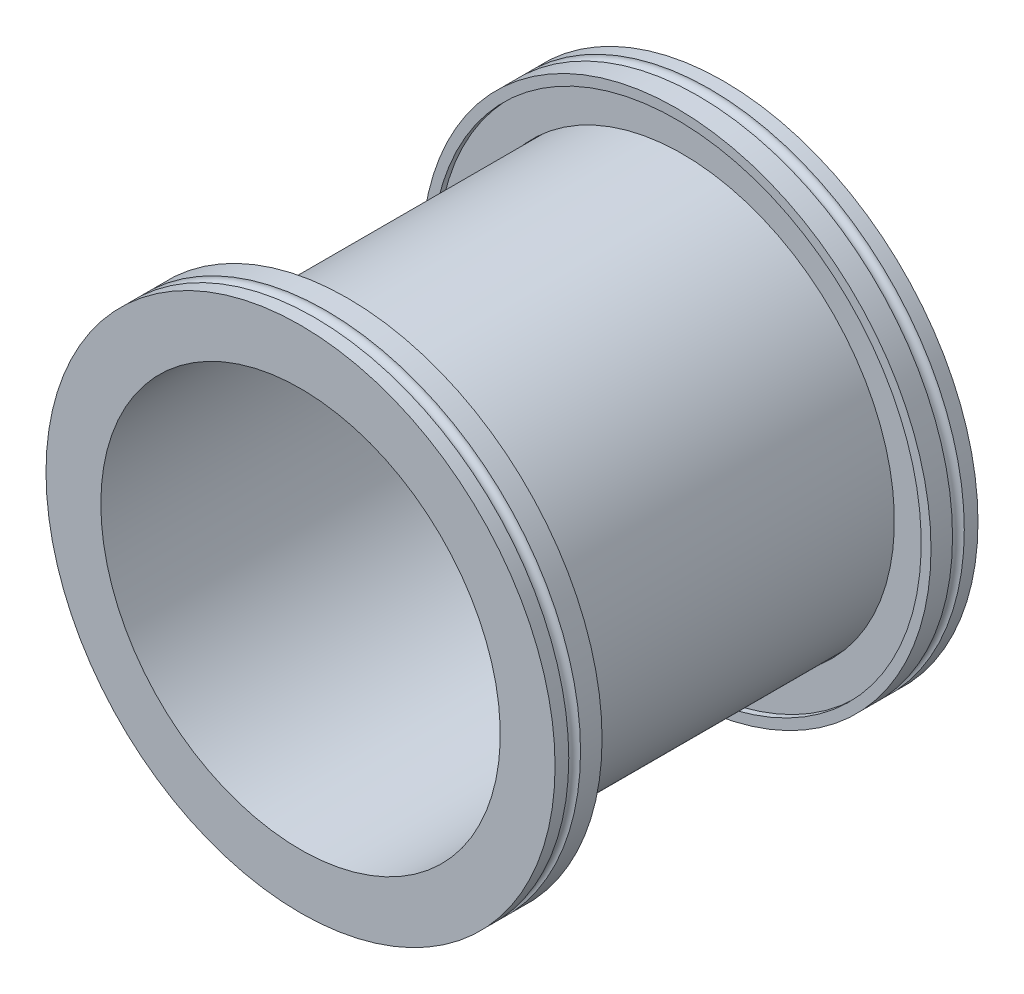
ISO-10303-21;
HEADER;
FILE_DESCRIPTION(('STEP AP214'),'2;1');
FILE_NAME('part.step','',(''),(''),'','','');
FILE_SCHEMA(('AUTOMOTIVE_DESIGN { 1 0 10303 214 1 1 1 1 }'));
ENDSEC;
DATA;
#1=APPLICATION_CONTEXT('core data for automotive mechanical design processes');
#2=APPLICATION_PROTOCOL_DEFINITION('international standard','automotive_design',2000,#1);
#3=PRODUCT_CONTEXT('',#1,'mechanical');
#4=PRODUCT('Part','Part','',(#3));
#5=PRODUCT_RELATED_PRODUCT_CATEGORY('part','',(#4));
#6=PRODUCT_DEFINITION_FORMATION('','',#4);
#7=PRODUCT_DEFINITION_CONTEXT('part definition',#1,'design');
#8=PRODUCT_DEFINITION('design','',#6,#7);
#9=PRODUCT_DEFINITION_SHAPE('','',#8);
#10=(LENGTH_UNIT() NAMED_UNIT(*) SI_UNIT(.MILLI.,.METRE.));
#11=(NAMED_UNIT(*) PLANE_ANGLE_UNIT() SI_UNIT($,.RADIAN.));
#12=(NAMED_UNIT(*) SI_UNIT($,.STERADIAN.) SOLID_ANGLE_UNIT());
#13=UNCERTAINTY_MEASURE_WITH_UNIT(LENGTH_MEASURE(1.E-05),#10,'distance_accuracy_value','');
#14=(GEOMETRIC_REPRESENTATION_CONTEXT(3) GLOBAL_UNCERTAINTY_ASSIGNED_CONTEXT((#13)) GLOBAL_UNIT_ASSIGNED_CONTEXT((#10,
#11,#12)) REPRESENTATION_CONTEXT('',''));
#15=CARTESIAN_POINT('',(0.,0.,0.));
#16=DIRECTION('',(0.,0.,1.));
#17=DIRECTION('',(1.,0.,0.));
#18=AXIS2_PLACEMENT_3D('',#15,#16,#17);
#19=CARTESIAN_POINT('',(0.,0.,-108.));
#20=DIRECTION('',(0.,0.,-1.));
#21=DIRECTION('',(-1.,0.,0.));
#22=AXIS2_PLACEMENT_3D('',#19,#20,#21);
#23=PLANE('',#22);
#24=CARTESIAN_POINT('',(0.,0.,-108.));
#25=DIRECTION('',(0.,0.,-1.));
#26=DIRECTION('',(-1.,0.,0.));
#27=AXIS2_PLACEMENT_3D('',#24,#25,#26);
#28=CIRCLE('',#27,51.);
#29=CARTESIAN_POINT('',(-51.,0.,-108.));
#30=VERTEX_POINT('',#29);
#31=EDGE_CURVE('E143',#30,#30,#28,.T.);
#32=ORIENTED_EDGE('',*,*,#31,.F.);
#33=EDGE_LOOP('',(#32));
#34=FACE_BOUND('',#33,.T.);
#35=CARTESIAN_POINT('',(0.,0.,-108.));
#36=DIRECTION('',(0.,0.,-1.));
#37=DIRECTION('',(-1.,0.,0.));
#38=AXIS2_PLACEMENT_3D('',#35,#36,#37);
#39=CIRCLE('',#38,65.);
#40=CARTESIAN_POINT('',(-65.,0.,-108.));
#41=VERTEX_POINT('',#40);
#42=EDGE_CURVE('E189',#41,#41,#39,.T.);
#43=ORIENTED_EDGE('',*,*,#42,.T.);
#44=EDGE_LOOP('',(#43));
#45=FACE_BOUND('',#44,.T.);
#46=ADVANCED_FACE('F17',(#34,#45),#23,.T.);
#47=CARTESIAN_POINT('',(0.,0.,-102.));
#48=DIRECTION('',(0.,0.,1.));
#49=DIRECTION('',(1.,0.,0.));
#50=AXIS2_PLACEMENT_3D('',#47,#48,#49);
#51=PLANE('',#50);
#52=CARTESIAN_POINT('',(0.,0.,-102.));
#53=DIRECTION('',(0.,0.,1.));
#54=DIRECTION('',(1.,0.,0.));
#55=AXIS2_PLACEMENT_3D('',#52,#53,#54);
#56=CIRCLE('',#55,54.);
#57=CARTESIAN_POINT('',(54.,0.,-102.));
#58=VERTEX_POINT('',#57);
#59=EDGE_CURVE('E184',#58,#58,#56,.T.);
#60=ORIENTED_EDGE('',*,*,#59,.F.);
#61=EDGE_LOOP('',(#60));
#62=FACE_BOUND('',#61,.T.);
#63=CARTESIAN_POINT('',(0.,0.,-102.));
#64=DIRECTION('',(0.,0.,1.));
#65=DIRECTION('',(1.,0.,0.));
#66=AXIS2_PLACEMENT_3D('',#63,#64,#65);
#67=CIRCLE('',#66,54.15);
#68=CARTESIAN_POINT('',(-54.15,0.,-102.));
#69=VERTEX_POINT('',#68);
#70=EDGE_CURVE('E195',#69,#69,#67,.T.);
#71=ORIENTED_EDGE('',*,*,#70,.T.);
#72=EDGE_LOOP('',(#71));
#73=FACE_BOUND('',#72,.T.);
#74=ADVANCED_FACE('F226',(#62,#73),#51,.T.);
#75=CARTESIAN_POINT('',(0.,0.,-97.5));
#76=DIRECTION('',(0.,0.,1.));
#77=DIRECTION('',(1.,0.,0.));
#78=AXIS2_PLACEMENT_3D('',#75,#76,#77);
#79=PLANE('',#78);
#80=CARTESIAN_POINT('',(0.,0.,-97.5));
#81=DIRECTION('',(0.,0.,-1.));
#82=DIRECTION('',(1.,0.,0.));
#83=AXIS2_PLACEMENT_3D('',#80,#81,#82);
#84=CIRCLE('',#83,54.15);
#85=CARTESIAN_POINT('',(-54.15,0.,-97.5));
#86=VERTEX_POINT('',#85);
#87=EDGE_CURVE('E135',#86,#86,#84,.T.);
#88=ORIENTED_EDGE('',*,*,#87,.T.);
#89=EDGE_LOOP('',(#88));
#90=FACE_BOUND('',#89,.T.);
#91=CARTESIAN_POINT('',(0.,0.,-97.5));
#92=DIRECTION('',(0.,0.,1.));
#93=DIRECTION('',(1.,0.,0.));
#94=AXIS2_PLACEMENT_3D('',#91,#92,#93);
#95=CIRCLE('',#94,62.5);
#96=CARTESIAN_POINT('',(-62.5,0.,-97.5));
#97=VERTEX_POINT('',#96);
#98=EDGE_CURVE('E138',#97,#97,#95,.T.);
#99=ORIENTED_EDGE('',*,*,#98,.T.);
#100=EDGE_LOOP('',(#99));
#101=FACE_BOUND('',#100,.T.);
#102=ADVANCED_FACE('F228',(#90,#101),#79,.T.);
#103=CARTESIAN_POINT('',(0.,0.,-96.));
#104=DIRECTION('',(0.,0.,-1.));
#105=DIRECTION('',(-1.,0.,0.));
#106=AXIS2_PLACEMENT_3D('',#103,#104,#105);
#107=PLANE('',#106);
#108=CARTESIAN_POINT('',(0.,0.,-96.));
#109=DIRECTION('',(0.,0.,1.));
#110=DIRECTION('',(1.,0.,0.));
#111=AXIS2_PLACEMENT_3D('',#108,#109,#110);
#112=CIRCLE('',#111,62.5);
#113=CARTESIAN_POINT('',(-62.5,0.,-96.));
#114=VERTEX_POINT('',#113);
#115=EDGE_CURVE('E140',#114,#114,#112,.T.);
#116=ORIENTED_EDGE('',*,*,#115,.F.);
#117=EDGE_LOOP('',(#116));
#118=FACE_BOUND('',#117,.T.);
#119=CARTESIAN_POINT('',(0.,0.,-96.));
#120=DIRECTION('',(0.,0.,-1.));
#121=DIRECTION('',(-1.,0.,0.));
#122=AXIS2_PLACEMENT_3D('',#119,#120,#121);
#123=CIRCLE('',#122,65.);
#124=CARTESIAN_POINT('',(-65.,0.,-96.));
#125=VERTEX_POINT('',#124);
#126=EDGE_CURVE('E185',#125,#125,#123,.T.);
#127=ORIENTED_EDGE('',*,*,#126,.F.);
#128=EDGE_LOOP('',(#127));
#129=FACE_BOUND('',#128,.T.);
#130=ADVANCED_FACE('F236',(#118,#129),#107,.F.);
#131=CARTESIAN_POINT('',(0.,0.,0.));
#132=DIRECTION('',(0.,0.,1.));
#133=DIRECTION('',(1.,0.,0.));
#134=AXIS2_PLACEMENT_3D('',#131,#132,#133);
#135=PLANE('',#134);
#136=CARTESIAN_POINT('',(0.,0.,0.));
#137=DIRECTION('',(0.,0.,1.));
#138=DIRECTION('',(1.,0.,0.));
#139=AXIS2_PLACEMENT_3D('',#136,#137,#138);
#140=CIRCLE('',#139,51.);
#141=CARTESIAN_POINT('',(-51.,0.,0.));
#142=VERTEX_POINT('',#141);
#143=EDGE_CURVE('E126',#142,#142,#140,.T.);
#144=ORIENTED_EDGE('',*,*,#143,.F.);
#145=EDGE_LOOP('',(#144));
#146=FACE_BOUND('',#145,.T.);
#147=CARTESIAN_POINT('',(0.,0.,0.));
#148=DIRECTION('',(0.,0.,1.));
#149=DIRECTION('',(1.,0.,0.));
#150=AXIS2_PLACEMENT_3D('',#147,#148,#149);
#151=CIRCLE('',#150,65.);
#152=CARTESIAN_POINT('',(65.,0.,0.));
#153=VERTEX_POINT('',#152);
#154=EDGE_CURVE('E110',#153,#153,#151,.T.);
#155=ORIENTED_EDGE('',*,*,#154,.T.);
#156=EDGE_LOOP('',(#155));
#157=FACE_BOUND('',#156,.T.);
#158=ADVANCED_FACE('F111',(#146,#157),#135,.T.);
#159=CARTESIAN_POINT('',(0.,0.,-6.));
#160=DIRECTION('',(0.,0.,-1.));
#161=DIRECTION('',(0.,-1.,0.));
#162=AXIS2_PLACEMENT_3D('',#159,#160,#161);
#163=PLANE('',#162);
#164=CARTESIAN_POINT('',(0.,0.,-6.));
#165=DIRECTION('',(0.,0.,1.));
#166=DIRECTION('',(1.,0.,0.));
#167=AXIS2_PLACEMENT_3D('',#164,#165,#166);
#168=CIRCLE('',#167,54.);
#169=CARTESIAN_POINT('',(54.,0.,-6.));
#170=VERTEX_POINT('',#169);
#171=EDGE_CURVE('E199',#170,#170,#168,.T.);
#172=ORIENTED_EDGE('',*,*,#171,.T.);
#173=EDGE_LOOP('',(#172));
#174=FACE_BOUND('',#173,.T.);
#175=CARTESIAN_POINT('',(0.,0.,-6.));
#176=DIRECTION('',(0.,0.,-1.));
#177=DIRECTION('',(-1.,0.,0.));
#178=AXIS2_PLACEMENT_3D('',#175,#176,#177);
#179=CIRCLE('',#178,54.15);
#180=CARTESIAN_POINT('',(54.15,0.,-6.));
#181=VERTEX_POINT('',#180);
#182=EDGE_CURVE('E130',#181,#181,#179,.T.);
#183=ORIENTED_EDGE('',*,*,#182,.T.);
#184=EDGE_LOOP('',(#183));
#185=FACE_BOUND('',#184,.T.);
#186=ADVANCED_FACE('F248',(#174,#185),#163,.T.);
#187=CARTESIAN_POINT('',(0.,0.,-10.5));
#188=DIRECTION('',(0.,0.,-1.));
#189=DIRECTION('',(0.,-1.,0.));
#190=AXIS2_PLACEMENT_3D('',#187,#188,#189);
#191=PLANE('',#190);
#192=CARTESIAN_POINT('',(0.,0.,-10.5));
#193=DIRECTION('',(0.,0.,1.));
#194=DIRECTION('',(-1.,0.,0.));
#195=AXIS2_PLACEMENT_3D('',#192,#193,#194);
#196=CIRCLE('',#195,54.15);
#197=CARTESIAN_POINT('',(54.15,0.,-10.5));
#198=VERTEX_POINT('',#197);
#199=EDGE_CURVE('E147',#198,#198,#196,.T.);
#200=ORIENTED_EDGE('',*,*,#199,.T.);
#201=EDGE_LOOP('',(#200));
#202=FACE_BOUND('',#201,.T.);
#203=CARTESIAN_POINT('',(0.,0.,-10.5));
#204=DIRECTION('',(0.,0.,-1.));
#205=DIRECTION('',(-1.,0.,0.));
#206=AXIS2_PLACEMENT_3D('',#203,#204,#205);
#207=CIRCLE('',#206,62.5);
#208=CARTESIAN_POINT('',(62.5,0.,-10.5));
#209=VERTEX_POINT('',#208);
#210=EDGE_CURVE('E148',#209,#209,#207,.T.);
#211=ORIENTED_EDGE('',*,*,#210,.T.);
#212=EDGE_LOOP('',(#211));
#213=FACE_BOUND('',#212,.T.);
#214=ADVANCED_FACE('F244',(#202,#213),#191,.T.);
#215=CARTESIAN_POINT('',(0.,0.,-12.));
#216=DIRECTION('',(0.,0.,1.));
#217=DIRECTION('',(1.,0.,0.));
#218=AXIS2_PLACEMENT_3D('',#215,#216,#217);
#219=PLANE('',#218);
#220=CARTESIAN_POINT('',(0.,0.,-12.));
#221=DIRECTION('',(0.,0.,-1.));
#222=DIRECTION('',(-1.,0.,0.));
#223=AXIS2_PLACEMENT_3D('',#220,#221,#222);
#224=CIRCLE('',#223,62.5);
#225=CARTESIAN_POINT('',(62.5,0.,-12.));
#226=VERTEX_POINT('',#225);
#227=EDGE_CURVE('E11',#226,#226,#224,.T.);
#228=ORIENTED_EDGE('',*,*,#227,.F.);
#229=EDGE_LOOP('',(#228));
#230=FACE_BOUND('',#229,.T.);
#231=CARTESIAN_POINT('',(0.,0.,-12.));
#232=DIRECTION('',(0.,0.,1.));
#233=DIRECTION('',(1.,0.,0.));
#234=AXIS2_PLACEMENT_3D('',#231,#232,#233);
#235=CIRCLE('',#234,65.);
#236=CARTESIAN_POINT('',(65.,0.,-12.));
#237=VERTEX_POINT('',#236);
#238=EDGE_CURVE('E115',#237,#237,#235,.T.);
#239=ORIENTED_EDGE('',*,*,#238,.F.);
#240=EDGE_LOOP('',(#239));
#241=FACE_BOUND('',#240,.T.);
#242=ADVANCED_FACE('F291',(#230,#241),#219,.F.);
#243=CARTESIAN_POINT('',(0.,0.,-10.5));
#244=DIRECTION('',(0.,0.,-1.));
#245=DIRECTION('',(-1.,0.,0.));
#246=AXIS2_PLACEMENT_3D('',#243,#244,#245);
#247=CYLINDRICAL_SURFACE('',#246,62.5);
#248=ORIENTED_EDGE('',*,*,#210,.F.);
#249=DIRECTION('',(0.,0.,-1.));
#250=VECTOR('',#249,1.);
#251=CARTESIAN_POINT('',(62.5,0.,-10.5));
#252=LINE('',#251,#250);
#253=EDGE_CURVE('E28',#209,#226,#252,.T.);
#254=ORIENTED_EDGE('',*,*,#253,.T.);
#255=ORIENTED_EDGE('',*,*,#227,.T.);
#256=ORIENTED_EDGE('',*,*,#253,.F.);
#257=EDGE_LOOP('',(#248,#254,#255,#256));
#258=FACE_BOUND('',#257,.T.);
#259=ADVANCED_FACE('F254',(#258),#247,.F.);
#260=CARTESIAN_POINT('',(0.,0.,-6.));
#261=DIRECTION('',(0.,0.,-1.));
#262=DIRECTION('',(-1.,0.,0.));
#263=AXIS2_PLACEMENT_3D('',#260,#261,#262);
#264=CYLINDRICAL_SURFACE('',#263,54.15);
#265=ORIENTED_EDGE('',*,*,#182,.F.);
#266=DIRECTION('',(0.,0.,-1.));
#267=VECTOR('',#266,1.);
#268=CARTESIAN_POINT('',(54.15,0.,-6.));
#269=LINE('',#268,#267);
#270=EDGE_CURVE('E134',#181,#198,#269,.T.);
#271=ORIENTED_EDGE('',*,*,#270,.T.);
#272=ORIENTED_EDGE('',*,*,#199,.F.);
#273=ORIENTED_EDGE('',*,*,#270,.F.);
#274=EDGE_LOOP('',(#265,#271,#272,#273));
#275=FACE_BOUND('',#274,.T.);
#276=ADVANCED_FACE('F250',(#275),#264,.F.);
#277=CARTESIAN_POINT('',(0.,0.,0.));
#278=DIRECTION('',(0.,0.,-1.));
#279=DIRECTION('',(-1.,0.,0.));
#280=AXIS2_PLACEMENT_3D('',#277,#278,#279);
#281=CYLINDRICAL_SURFACE('',#280,65.);
#282=ORIENTED_EDGE('',*,*,#238,.T.);
#283=DIRECTION('',(0.,0.,1.));
#284=VECTOR('',#283,1.);
#285=CARTESIAN_POINT('',(65.,0.,0.));
#286=LINE('',#285,#284);
#287=CARTESIAN_POINT('',(65.,0.,-6.5));
#288=VERTEX_POINT('',#287);
#289=EDGE_CURVE('E124',#237,#288,#286,.T.);
#290=ORIENTED_EDGE('',*,*,#289,.T.);
#291=CARTESIAN_POINT('',(0.,0.,-6.5));
#292=DIRECTION('',(0.,0.,1.));
#293=DIRECTION('',(1.,0.,0.));
#294=AXIS2_PLACEMENT_3D('',#291,#292,#293);
#295=CIRCLE('',#294,65.);
#296=EDGE_CURVE('E165',#288,#288,#295,.T.);
#297=ORIENTED_EDGE('',*,*,#296,.F.);
#298=ORIENTED_EDGE('',*,*,#289,.F.);
#299=EDGE_LOOP('',(#282,#290,#297,#298));
#300=FACE_BOUND('',#299,.T.);
#301=ADVANCED_FACE('F253',(#300),#281,.T.);
#302=CARTESIAN_POINT('',(0.,0.,0.));
#303=DIRECTION('',(0.,0.,-1.));
#304=DIRECTION('',(-1.,0.,0.));
#305=AXIS2_PLACEMENT_3D('',#302,#303,#304);
#306=CYLINDRICAL_SURFACE('',#305,65.);
#307=CARTESIAN_POINT('',(0.,0.,-3.5));
#308=DIRECTION('',(0.,0.,-1.));
#309=DIRECTION('',(-1.,0.,0.));
#310=AXIS2_PLACEMENT_3D('',#307,#308,#309);
#311=CIRCLE('',#310,65.);
#312=CARTESIAN_POINT('',(65.,0.,-3.5));
#313=VERTEX_POINT('',#312);
#314=EDGE_CURVE('E174',#313,#313,#311,.T.);
#315=ORIENTED_EDGE('',*,*,#314,.F.);
#316=DIRECTION('',(0.,0.,1.));
#317=VECTOR('',#316,1.);
#318=CARTESIAN_POINT('',(65.,0.,0.));
#319=LINE('',#318,#317);
#320=EDGE_CURVE('E116',#313,#153,#319,.T.);
#321=ORIENTED_EDGE('',*,*,#320,.T.);
#322=ORIENTED_EDGE('',*,*,#154,.F.);
#323=ORIENTED_EDGE('',*,*,#320,.F.);
#324=EDGE_LOOP('',(#315,#321,#322,#323));
#325=FACE_BOUND('',#324,.T.);
#326=ADVANCED_FACE('F267',(#325),#306,.T.);
#327=CARTESIAN_POINT('',(0.,0.,-12.));
#328=DIRECTION('',(0.,0.,1.));
#329=DIRECTION('',(1.,0.,0.));
#330=AXIS2_PLACEMENT_3D('',#327,#328,#329);
#331=CYLINDRICAL_SURFACE('',#330,51.);
#332=ORIENTED_EDGE('',*,*,#31,.T.);
#333=DIRECTION('',(0.,0.,1.));
#334=VECTOR('',#333,1.);
#335=CARTESIAN_POINT('',(-51.,0.,-12.));
#336=LINE('',#335,#334);
#337=EDGE_CURVE('E173',#30,#142,#336,.T.);
#338=ORIENTED_EDGE('',*,*,#337,.T.);
#339=ORIENTED_EDGE('',*,*,#143,.T.);
#340=ORIENTED_EDGE('',*,*,#337,.F.);
#341=EDGE_LOOP('',(#332,#338,#339,#340));
#342=FACE_BOUND('',#341,.T.);
#343=ADVANCED_FACE('F265',(#342),#331,.F.);
#344=CARTESIAN_POINT('',(0.,0.,-97.5));
#345=DIRECTION('',(0.,0.,1.));
#346=DIRECTION('',(1.,0.,0.));
#347=AXIS2_PLACEMENT_3D('',#344,#345,#346);
#348=CYLINDRICAL_SURFACE('',#347,62.5);
#349=ORIENTED_EDGE('',*,*,#98,.F.);
#350=DIRECTION('',(0.,0.,1.));
#351=VECTOR('',#350,1.);
#352=CARTESIAN_POINT('',(-62.5,0.,-97.5));
#353=LINE('',#352,#351);
#354=EDGE_CURVE('E144',#97,#114,#353,.T.);
#355=ORIENTED_EDGE('',*,*,#354,.T.);
#356=ORIENTED_EDGE('',*,*,#115,.T.);
#357=ORIENTED_EDGE('',*,*,#354,.F.);
#358=EDGE_LOOP('',(#349,#355,#356,#357));
#359=FACE_BOUND('',#358,.T.);
#360=ADVANCED_FACE('F262',(#359),#348,.F.);
#361=CARTESIAN_POINT('',(0.,0.,-102.));
#362=DIRECTION('',(0.,0.,1.));
#363=DIRECTION('',(1.,0.,0.));
#364=AXIS2_PLACEMENT_3D('',#361,#362,#363);
#365=CYLINDRICAL_SURFACE('',#364,54.15);
#366=ORIENTED_EDGE('',*,*,#70,.F.);
#367=DIRECTION('',(0.,0.,1.));
#368=VECTOR('',#367,1.);
#369=CARTESIAN_POINT('',(-54.15,0.,-102.));
#370=LINE('',#369,#368);
#371=EDGE_CURVE('E139',#69,#86,#370,.T.);
#372=ORIENTED_EDGE('',*,*,#371,.T.);
#373=ORIENTED_EDGE('',*,*,#87,.F.);
#374=ORIENTED_EDGE('',*,*,#371,.F.);
#375=EDGE_LOOP('',(#366,#372,#373,#374));
#376=FACE_BOUND('',#375,.T.);
#377=ADVANCED_FACE('F224',(#376),#365,.F.);
#378=CARTESIAN_POINT('',(0.,0.,-6.));
#379=DIRECTION('',(0.,0.,-1.));
#380=DIRECTION('',(-1.,0.,0.));
#381=AXIS2_PLACEMENT_3D('',#378,#379,#380);
#382=CYLINDRICAL_SURFACE('',#381,54.);
#383=ORIENTED_EDGE('',*,*,#59,.T.);
#384=DIRECTION('',(0.,0.,1.));
#385=VECTOR('',#384,1.);
#386=CARTESIAN_POINT('',(54.,0.,-6.));
#387=LINE('',#386,#385);
#388=EDGE_CURVE('E209',#58,#170,#387,.T.);
#389=ORIENTED_EDGE('',*,*,#388,.T.);
#390=ORIENTED_EDGE('',*,*,#171,.F.);
#391=ORIENTED_EDGE('',*,*,#388,.F.);
#392=EDGE_LOOP('',(#383,#389,#390,#391));
#393=FACE_BOUND('',#392,.T.);
#394=ADVANCED_FACE('F261',(#393),#382,.T.);
#395=CARTESIAN_POINT('',(0.,0.,-108.));
#396=DIRECTION('',(0.,0.,1.));
#397=DIRECTION('',(1.,0.,0.));
#398=AXIS2_PLACEMENT_3D('',#395,#396,#397);
#399=CYLINDRICAL_SURFACE('',#398,65.);
#400=ORIENTED_EDGE('',*,*,#126,.T.);
#401=DIRECTION('',(0.,0.,-1.));
#402=VECTOR('',#401,1.);
#403=CARTESIAN_POINT('',(-65.,0.,-108.));
#404=LINE('',#403,#402);
#405=CARTESIAN_POINT('',(-65.,0.,-101.5));
#406=VERTEX_POINT('',#405);
#407=EDGE_CURVE('E180',#125,#406,#404,.T.);
#408=ORIENTED_EDGE('',*,*,#407,.T.);
#409=CARTESIAN_POINT('',(0.,0.,-101.5));
#410=DIRECTION('',(0.,0.,-1.));
#411=DIRECTION('',(-1.,0.,0.));
#412=AXIS2_PLACEMENT_3D('',#409,#410,#411);
#413=CIRCLE('',#412,65.);
#414=EDGE_CURVE('E211',#406,#406,#413,.T.);
#415=ORIENTED_EDGE('',*,*,#414,.F.);
#416=ORIENTED_EDGE('',*,*,#407,.F.);
#417=EDGE_LOOP('',(#400,#408,#415,#416));
#418=FACE_BOUND('',#417,.T.);
#419=ADVANCED_FACE('F283',(#418),#399,.T.);
#420=CARTESIAN_POINT('',(0.,0.,-108.));
#421=DIRECTION('',(0.,0.,1.));
#422=DIRECTION('',(1.,0.,0.));
#423=AXIS2_PLACEMENT_3D('',#420,#421,#422);
#424=CYLINDRICAL_SURFACE('',#423,65.);
#425=CARTESIAN_POINT('',(0.,0.,-104.5));
#426=DIRECTION('',(0.,0.,1.));
#427=DIRECTION('',(1.,0.,0.));
#428=AXIS2_PLACEMENT_3D('',#425,#426,#427);
#429=CIRCLE('',#428,65.);
#430=CARTESIAN_POINT('',(-65.,0.,-104.5));
#431=VERTEX_POINT('',#430);
#432=EDGE_CURVE('E200',#431,#431,#429,.T.);
#433=ORIENTED_EDGE('',*,*,#432,.F.);
#434=DIRECTION('',(0.,0.,-1.));
#435=VECTOR('',#434,1.);
#436=CARTESIAN_POINT('',(-65.,0.,-108.));
#437=LINE('',#436,#435);
#438=EDGE_CURVE('E178',#431,#41,#437,.T.);
#439=ORIENTED_EDGE('',*,*,#438,.T.);
#440=ORIENTED_EDGE('',*,*,#42,.F.);
#441=ORIENTED_EDGE('',*,*,#438,.F.);
#442=EDGE_LOOP('',(#433,#439,#440,#441));
#443=FACE_BOUND('',#442,.T.);
#444=ADVANCED_FACE('F19',(#443),#424,.T.);
#445=CARTESIAN_POINT('',(0.,0.,-5.));
#446=DIRECTION('',(0.,0.,-1.));
#447=DIRECTION('',(-1.,0.,0.));
#448=AXIS2_PLACEMENT_3D('',#445,#446,#447);
#449=TOROIDAL_SURFACE('',#448,65.,1.5);
#450=ORIENTED_EDGE('',*,*,#296,.T.);
#451=CARTESIAN_POINT('',(65.,0.,-5.));
#452=DIRECTION('',(0.,1.,0.));
#453=DIRECTION('',(1.,0.,0.));
#454=AXIS2_PLACEMENT_3D('',#451,#452,#453);
#455=CIRCLE('',#454,1.5);
#456=EDGE_CURVE('E179',#288,#313,#455,.T.);
#457=ORIENTED_EDGE('',*,*,#456,.T.);
#458=ORIENTED_EDGE('',*,*,#314,.T.);
#459=ORIENTED_EDGE('',*,*,#456,.F.);
#460=EDGE_LOOP('',(#450,#457,#458,#459));
#461=FACE_BOUND('',#460,.T.);
#462=ADVANCED_FACE('F272',(#461),#449,.F.);
#463=CARTESIAN_POINT('',(0.,0.,-103.));
#464=DIRECTION('',(0.,0.,1.));
#465=DIRECTION('',(1.,0.,0.));
#466=AXIS2_PLACEMENT_3D('',#463,#464,#465);
#467=TOROIDAL_SURFACE('',#466,65.,1.5);
#468=ORIENTED_EDGE('',*,*,#414,.T.);
#469=CARTESIAN_POINT('',(-65.,0.,-103.));
#470=DIRECTION('',(0.,1.,0.));
#471=DIRECTION('',(-1.,0.,0.));
#472=AXIS2_PLACEMENT_3D('',#469,#470,#471);
#473=CIRCLE('',#472,1.5);
#474=EDGE_CURVE('E21',#406,#431,#473,.T.);
#475=ORIENTED_EDGE('',*,*,#474,.T.);
#476=ORIENTED_EDGE('',*,*,#432,.T.);
#477=ORIENTED_EDGE('',*,*,#474,.F.);
#478=EDGE_LOOP('',(#468,#475,#476,#477));
#479=FACE_BOUND('',#478,.T.);
#480=ADVANCED_FACE('F270',(#479),#467,.F.);
#481=CLOSED_SHELL('',(#46,#74,#102,#130,#158,#186,#214,#242,#259,#276,#301,#326,#343,#360,#377,
#394,#419,#444,#462,#480));
#482=MANIFOLD_SOLID_BREP('B1',#481);
#483=ADVANCED_BREP_SHAPE_REPRESENTATION('',(#18,#482),#14);
#484=SHAPE_DEFINITION_REPRESENTATION(#9,#483);
ENDSEC;
END-ISO-10303-21;
